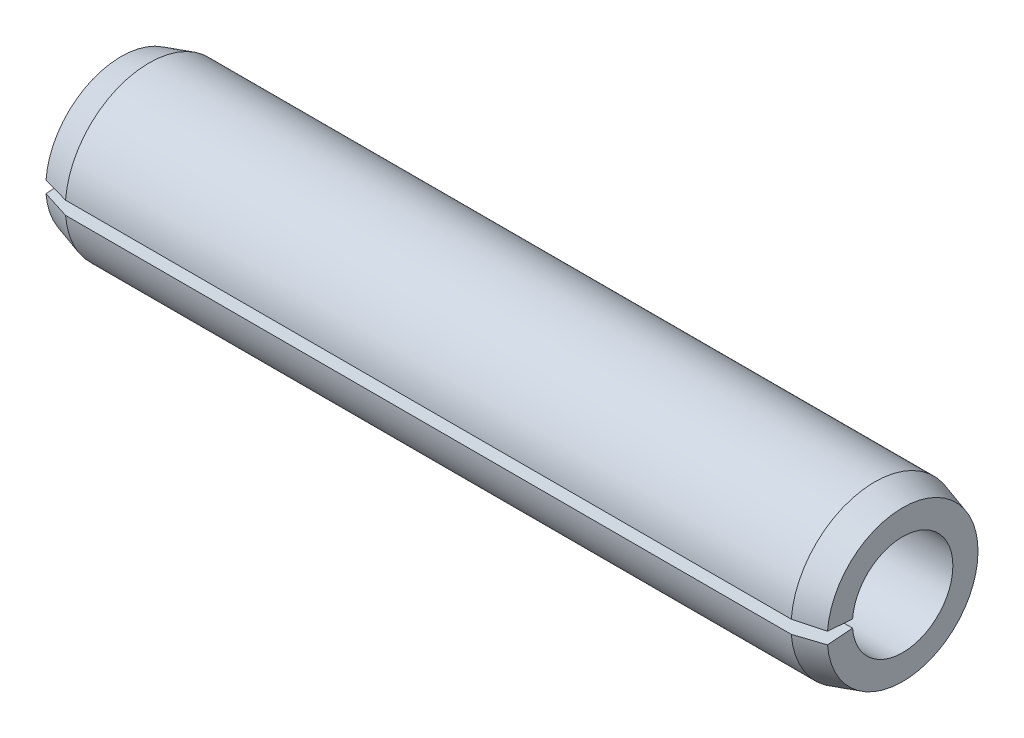
ISO-10303-21;
HEADER;
FILE_DESCRIPTION(('STEP AP214'),'2;1');
FILE_NAME('part.step','',(''),(''),'','','');
FILE_SCHEMA(('AUTOMOTIVE_DESIGN { 1 0 10303 214 1 1 1 1 }'));
ENDSEC;
DATA;
#1=APPLICATION_CONTEXT('core data for automotive mechanical design processes');
#2=APPLICATION_PROTOCOL_DEFINITION('international standard','automotive_design',2000,#1);
#3=PRODUCT_CONTEXT('',#1,'mechanical');
#4=PRODUCT('Part','Part','',(#3));
#5=PRODUCT_RELATED_PRODUCT_CATEGORY('part','',(#4));
#6=PRODUCT_DEFINITION_FORMATION('','',#4);
#7=PRODUCT_DEFINITION_CONTEXT('part definition',#1,'design');
#8=PRODUCT_DEFINITION('design','',#6,#7);
#9=PRODUCT_DEFINITION_SHAPE('','',#8);
#10=(LENGTH_UNIT() NAMED_UNIT(*) SI_UNIT(.MILLI.,.METRE.));
#11=(NAMED_UNIT(*) PLANE_ANGLE_UNIT() SI_UNIT($,.RADIAN.));
#12=(NAMED_UNIT(*) SI_UNIT($,.STERADIAN.) SOLID_ANGLE_UNIT());
#13=UNCERTAINTY_MEASURE_WITH_UNIT(LENGTH_MEASURE(1.E-05),#10,'distance_accuracy_value','');
#14=(GEOMETRIC_REPRESENTATION_CONTEXT(3) GLOBAL_UNCERTAINTY_ASSIGNED_CONTEXT((#13)) GLOBAL_UNIT_ASSIGNED_CONTEXT((#10,
#11,#12)) REPRESENTATION_CONTEXT('',''));
#15=CARTESIAN_POINT('',(0.,0.,0.));
#16=DIRECTION('',(0.,0.,1.));
#17=DIRECTION('',(1.,0.,0.));
#18=AXIS2_PLACEMENT_3D('',#15,#16,#17);
#19=CARTESIAN_POINT('',(0.,1.35,0.));
#20=DIRECTION('',(1.,0.,0.));
#21=DIRECTION('',(0.,0.,-1.));
#22=AXIS2_PLACEMENT_3D('',#19,#20,#21);
#23=PLANE('',#22);
#24=DIRECTION('',(0.,0.0784590957278456,0.996917333733128));
#25=VECTOR('',#24,1.);
#26=CARTESIAN_POINT('',(0.,0.,0.));
#27=LINE('',#26,#25);
#28=CARTESIAN_POINT('',(0.,0.0706131861550611,0.897225600359815));
#29=VERTEX_POINT('',#28);
#30=CARTESIAN_POINT('',(0.,0.105919779232592,1.34583840053972));
#31=VERTEX_POINT('',#30);
#32=EDGE_CURVE('E89',#29,#31,#27,.T.);
#33=ORIENTED_EDGE('',*,*,#32,.T.);
#34=CARTESIAN_POINT('',(0.,0.,0.));
#35=DIRECTION('',(-1.,0.,0.));
#36=DIRECTION('',(0.,0.,1.));
#37=AXIS2_PLACEMENT_3D('',#34,#35,#36);
#38=CIRCLE('',#37,1.35);
#39=CARTESIAN_POINT('',(0.,-0.105919779232592,1.34583840053972));
#40=VERTEX_POINT('',#39);
#41=EDGE_CURVE('E107',#31,#40,#38,.T.);
#42=ORIENTED_EDGE('',*,*,#41,.T.);
#43=DIRECTION('',(0.,-0.0784590957278456,0.996917333733128));
#44=VECTOR('',#43,1.);
#45=CARTESIAN_POINT('',(0.,0.,0.));
#46=LINE('',#45,#44);
#47=CARTESIAN_POINT('',(0.,-0.0706131861550611,0.897225600359815));
#48=VERTEX_POINT('',#47);
#49=EDGE_CURVE('E61',#48,#40,#46,.T.);
#50=ORIENTED_EDGE('',*,*,#49,.F.);
#51=CARTESIAN_POINT('',(0.,0.,0.));
#52=DIRECTION('',(-1.,0.,0.));
#53=DIRECTION('',(0.,0.,1.));
#54=AXIS2_PLACEMENT_3D('',#51,#52,#53);
#55=CIRCLE('',#54,0.9);
#56=EDGE_CURVE('E104',#29,#48,#55,.T.);
#57=ORIENTED_EDGE('',*,*,#56,.F.);
#58=EDGE_LOOP('',(#33,#42,#50,#57));
#59=FACE_BOUND('',#58,.T.);
#60=ADVANCED_FACE('F40',(#59),#23,.F.);
#61=CARTESIAN_POINT('',(-9.52499999999999,0.,0.));
#62=DIRECTION('',(-1.,0.,0.));
#63=DIRECTION('',(0.,0.,1.));
#64=AXIS2_PLACEMENT_3D('',#61,#62,#63);
#65=CYLINDRICAL_SURFACE('',#64,0.9);
#66=DIRECTION('',(-1.,0.,0.));
#67=VECTOR('',#66,1.);
#68=CARTESIAN_POINT('',(-9.52499999999999,0.070613186155061,0.897225600359815));
#69=LINE('',#68,#67);
#70=CARTESIAN_POINT('',(14.,0.0706131861550611,0.897225600359815));
#71=VERTEX_POINT('',#70);
#72=EDGE_CURVE('E92',#29,#71,#69,.F.);
#73=ORIENTED_EDGE('',*,*,#72,.F.);
#74=ORIENTED_EDGE('',*,*,#56,.T.);
#75=DIRECTION('',(-1.,0.,0.));
#76=VECTOR('',#75,1.);
#77=CARTESIAN_POINT('',(-9.52499999999999,-0.070613186155061,0.897225600359815));
#78=LINE('',#77,#76);
#79=CARTESIAN_POINT('',(14.,-0.0706131861550611,0.897225600359815));
#80=VERTEX_POINT('',#79);
#81=EDGE_CURVE('E125',#48,#80,#78,.F.);
#82=ORIENTED_EDGE('',*,*,#81,.T.);
#83=CARTESIAN_POINT('',(14.,0.,0.));
#84=DIRECTION('',(-1.,0.,0.));
#85=DIRECTION('',(0.,0.,1.));
#86=AXIS2_PLACEMENT_3D('',#83,#84,#85);
#87=CIRCLE('',#86,0.9);
#88=EDGE_CURVE('E106',#71,#80,#87,.T.);
#89=ORIENTED_EDGE('',*,*,#88,.F.);
#90=EDGE_LOOP('',(#73,#74,#82,#89));
#91=FACE_BOUND('',#90,.T.);
#92=ADVANCED_FACE('F102',(#91),#65,.F.);
#93=CARTESIAN_POINT('',(14.,0.9,0.));
#94=DIRECTION('',(-1.,0.,0.));
#95=DIRECTION('',(0.,0.,1.));
#96=AXIS2_PLACEMENT_3D('',#93,#94,#95);
#97=PLANE('',#96);
#98=DIRECTION('',(0.,0.0784590957278456,0.996917333733128));
#99=VECTOR('',#98,1.);
#100=CARTESIAN_POINT('',(14.,0.,0.));
#101=LINE('',#100,#99);
#102=CARTESIAN_POINT('',(14.,0.105919779232592,1.34583840053972));
#103=VERTEX_POINT('',#102);
#104=EDGE_CURVE('E134',#71,#103,#101,.T.);
#105=ORIENTED_EDGE('',*,*,#104,.F.);
#106=ORIENTED_EDGE('',*,*,#88,.T.);
#107=DIRECTION('',(0.,-0.0784590957278456,0.996917333733128));
#108=VECTOR('',#107,1.);
#109=CARTESIAN_POINT('',(14.,0.,0.));
#110=LINE('',#109,#108);
#111=CARTESIAN_POINT('',(14.,-0.105919779232592,1.34583840053972));
#112=VERTEX_POINT('',#111);
#113=EDGE_CURVE('E133',#80,#112,#110,.T.);
#114=ORIENTED_EDGE('',*,*,#113,.T.);
#115=CARTESIAN_POINT('',(14.,0.,0.));
#116=DIRECTION('',(-1.,0.,0.));
#117=DIRECTION('',(0.,0.,1.));
#118=AXIS2_PLACEMENT_3D('',#115,#116,#117);
#119=CIRCLE('',#118,1.35);
#120=EDGE_CURVE('E111',#103,#112,#119,.T.);
#121=ORIENTED_EDGE('',*,*,#120,.F.);
#122=EDGE_LOOP('',(#105,#106,#114,#121));
#123=FACE_BOUND('',#122,.T.);
#124=ADVANCED_FACE('F144',(#123),#97,.F.);
#125=CARTESIAN_POINT('',(14.,0.,0.));
#126=DIRECTION('',(-1.,0.,0.));
#127=DIRECTION('',(0.,0.,1.));
#128=AXIS2_PLACEMENT_3D('',#125,#126,#127);
#129=CONICAL_SURFACE('',#128,1.35,0.29145679447787);
#130=DIRECTION('',(-0.957826285221151,0.0225450552608441,0.286462087932656));
#131=VECTOR('',#130,1.);
#132=CARTESIAN_POINT('',(18.5,0.,0.));
#133=LINE('',#132,#131);
#134=CARTESIAN_POINT('',(13.5,0.117688643591768,1.49537600059969));
#135=VERTEX_POINT('',#134);
#136=EDGE_CURVE('E108',#103,#135,#133,.T.);
#137=ORIENTED_EDGE('',*,*,#136,.F.);
#138=ORIENTED_EDGE('',*,*,#120,.T.);
#139=DIRECTION('',(-0.957826285221151,-0.0225450552608441,0.286462087932656));
#140=VECTOR('',#139,1.);
#141=CARTESIAN_POINT('',(18.5,0.,0.));
#142=LINE('',#141,#140);
#143=CARTESIAN_POINT('',(13.5,-0.117688643591768,1.49537600059969));
#144=VERTEX_POINT('',#143);
#145=EDGE_CURVE('E127',#112,#144,#142,.T.);
#146=ORIENTED_EDGE('',*,*,#145,.T.);
#147=CARTESIAN_POINT('',(13.5,0.,0.));
#148=DIRECTION('',(-1.,0.,0.));
#149=DIRECTION('',(0.,0.,1.));
#150=AXIS2_PLACEMENT_3D('',#147,#148,#149);
#151=CIRCLE('',#150,1.5);
#152=EDGE_CURVE('E116',#135,#144,#151,.T.);
#153=ORIENTED_EDGE('',*,*,#152,.F.);
#154=EDGE_LOOP('',(#137,#138,#146,#153));
#155=FACE_BOUND('',#154,.T.);
#156=ADVANCED_FACE('F143',(#155),#129,.T.);
#157=CARTESIAN_POINT('',(-9.52499999999999,0.,0.));
#158=DIRECTION('',(-1.,0.,0.));
#159=DIRECTION('',(0.,0.,1.));
#160=AXIS2_PLACEMENT_3D('',#157,#158,#159);
#161=CYLINDRICAL_SURFACE('',#160,1.5);
#162=DIRECTION('',(-1.,0.,0.));
#163=VECTOR('',#162,1.);
#164=CARTESIAN_POINT('',(-9.52499999999999,0.117688643591768,1.49537600059969));
#165=LINE('',#164,#163);
#166=CARTESIAN_POINT('',(0.5,0.117688643591768,1.49537600059969));
#167=VERTEX_POINT('',#166);
#168=EDGE_CURVE('E53',#135,#167,#165,.T.);
#169=ORIENTED_EDGE('',*,*,#168,.F.);
#170=ORIENTED_EDGE('',*,*,#152,.T.);
#171=DIRECTION('',(-1.,0.,0.));
#172=VECTOR('',#171,1.);
#173=CARTESIAN_POINT('',(-9.52499999999999,-0.117688643591768,1.49537600059969));
#174=LINE('',#173,#172);
#175=CARTESIAN_POINT('',(0.5,-0.117688643591768,1.49537600059969));
#176=VERTEX_POINT('',#175);
#177=EDGE_CURVE('E130',#144,#176,#174,.T.);
#178=ORIENTED_EDGE('',*,*,#177,.T.);
#179=CARTESIAN_POINT('',(0.5,0.,0.));
#180=DIRECTION('',(-1.,0.,0.));
#181=DIRECTION('',(0.,0.,1.));
#182=AXIS2_PLACEMENT_3D('',#179,#180,#181);
#183=CIRCLE('',#182,1.5);
#184=EDGE_CURVE('E119',#167,#176,#183,.T.);
#185=ORIENTED_EDGE('',*,*,#184,.F.);
#186=EDGE_LOOP('',(#169,#170,#178,#185));
#187=FACE_BOUND('',#186,.T.);
#188=ADVANCED_FACE('F147',(#187),#161,.T.);
#189=CARTESIAN_POINT('',(0.5,0.,0.));
#190=DIRECTION('',(1.,0.,0.));
#191=DIRECTION('',(0.,0.,-1.));
#192=AXIS2_PLACEMENT_3D('',#189,#190,#191);
#193=CONICAL_SURFACE('',#192,1.5,0.291456794477867);
#194=DIRECTION('',(-0.957826285221152,-0.0225450552608439,-0.286462087932653));
#195=VECTOR('',#194,1.);
#196=CARTESIAN_POINT('',(-4.50000000000001,0.,0.));
#197=LINE('',#196,#195);
#198=EDGE_CURVE('E11',#167,#31,#197,.T.);
#199=ORIENTED_EDGE('',*,*,#198,.F.);
#200=ORIENTED_EDGE('',*,*,#184,.T.);
#201=DIRECTION('',(-0.957826285221152,0.0225450552608439,-0.286462087932653));
#202=VECTOR('',#201,1.);
#203=CARTESIAN_POINT('',(-4.50000000000001,0.,0.));
#204=LINE('',#203,#202);
#205=EDGE_CURVE('E47',#176,#40,#204,.T.);
#206=ORIENTED_EDGE('',*,*,#205,.T.);
#207=ORIENTED_EDGE('',*,*,#41,.F.);
#208=EDGE_LOOP('',(#199,#200,#206,#207));
#209=FACE_BOUND('',#208,.T.);
#210=ADVANCED_FACE('F150',(#209),#193,.T.);
#211=CARTESIAN_POINT('',(14.,0.,0.));
#212=DIRECTION('',(0.,-0.996917333733128,-0.0784590957278456));
#213=DIRECTION('',(0.,0.0784590957278456,-0.996917333733128));
#214=AXIS2_PLACEMENT_3D('',#211,#212,#213);
#215=PLANE('',#214);
#216=ORIENTED_EDGE('',*,*,#49,.T.);
#217=ORIENTED_EDGE('',*,*,#205,.F.);
#218=ORIENTED_EDGE('',*,*,#177,.F.);
#219=ORIENTED_EDGE('',*,*,#145,.F.);
#220=ORIENTED_EDGE('',*,*,#113,.F.);
#221=ORIENTED_EDGE('',*,*,#81,.F.);
#222=EDGE_LOOP('',(#216,#217,#218,#219,#220,#221));
#223=FACE_BOUND('',#222,.T.);
#224=ADVANCED_FACE('F145',(#223),#215,.F.);
#225=CARTESIAN_POINT('',(14.,0.,0.));
#226=DIRECTION('',(0.,-0.996917333733128,0.0784590957278456));
#227=DIRECTION('',(0.,-0.0784590957278456,-0.996917333733128));
#228=AXIS2_PLACEMENT_3D('',#225,#226,#227);
#229=PLANE('',#228);
#230=ORIENTED_EDGE('',*,*,#72,.T.);
#231=ORIENTED_EDGE('',*,*,#104,.T.);
#232=ORIENTED_EDGE('',*,*,#136,.T.);
#233=ORIENTED_EDGE('',*,*,#168,.T.);
#234=ORIENTED_EDGE('',*,*,#198,.T.);
#235=ORIENTED_EDGE('',*,*,#32,.F.);
#236=EDGE_LOOP('',(#230,#231,#232,#233,#234,#235));
#237=FACE_BOUND('',#236,.T.);
#238=ADVANCED_FACE('F91',(#237),#229,.T.);
#239=CLOSED_SHELL('',(#60,#92,#124,#156,#188,#210,#224,#238));
#240=MANIFOLD_SOLID_BREP('B2',#239);
#241=ADVANCED_BREP_SHAPE_REPRESENTATION('',(#18,#240),#14);
#242=SHAPE_DEFINITION_REPRESENTATION(#9,#241);
ENDSEC;
END-ISO-10303-21;
